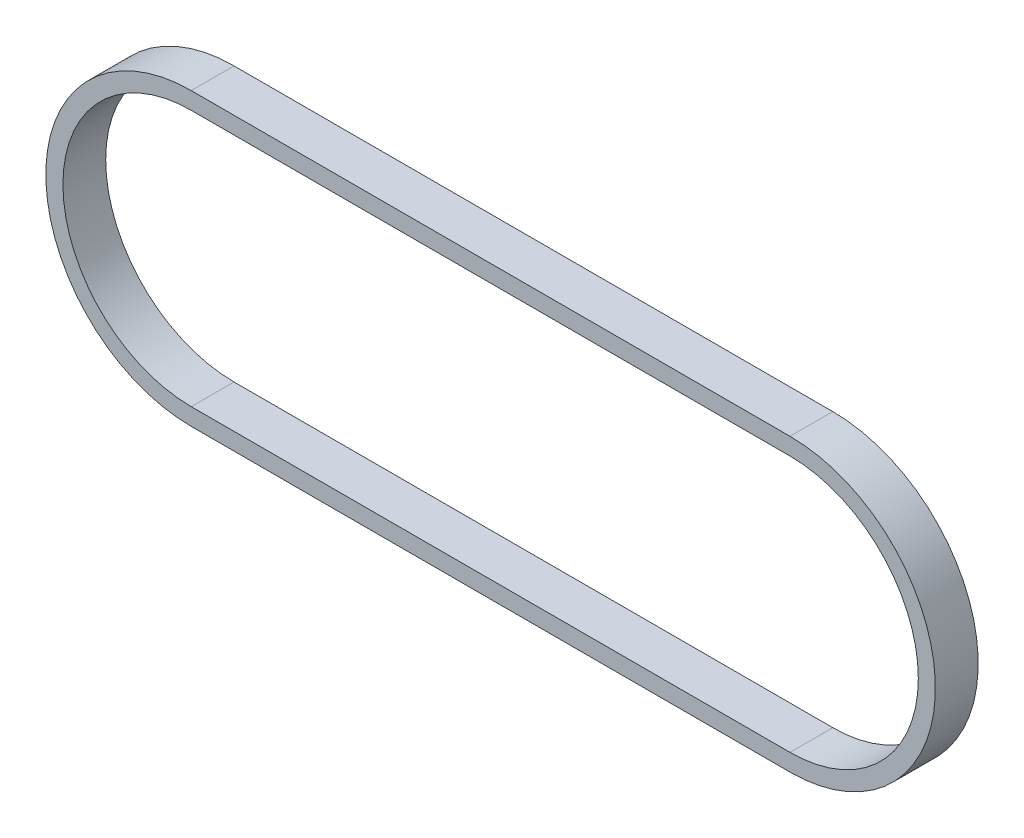
ISO-10303-21;
HEADER;
FILE_DESCRIPTION(('STEP AP214'),'2;1');
FILE_NAME('part.step','',(''),(''),'','','');
FILE_SCHEMA(('AUTOMOTIVE_DESIGN { 1 0 10303 214 1 1 1 1 }'));
ENDSEC;
DATA;
#1=APPLICATION_CONTEXT('core data for automotive mechanical design processes');
#2=APPLICATION_PROTOCOL_DEFINITION('international standard','automotive_design',2000,#1);
#3=PRODUCT_CONTEXT('',#1,'mechanical');
#4=PRODUCT('Part','Part','',(#3));
#5=PRODUCT_RELATED_PRODUCT_CATEGORY('part','',(#4));
#6=PRODUCT_DEFINITION_FORMATION('','',#4);
#7=PRODUCT_DEFINITION_CONTEXT('part definition',#1,'design');
#8=PRODUCT_DEFINITION('design','',#6,#7);
#9=PRODUCT_DEFINITION_SHAPE('','',#8);
#10=(LENGTH_UNIT() NAMED_UNIT(*) SI_UNIT(.MILLI.,.METRE.));
#11=(NAMED_UNIT(*) PLANE_ANGLE_UNIT() SI_UNIT($,.RADIAN.));
#12=(NAMED_UNIT(*) SI_UNIT($,.STERADIAN.) SOLID_ANGLE_UNIT());
#13=UNCERTAINTY_MEASURE_WITH_UNIT(LENGTH_MEASURE(1.E-05),#10,'distance_accuracy_value','');
#14=(GEOMETRIC_REPRESENTATION_CONTEXT(3) GLOBAL_UNCERTAINTY_ASSIGNED_CONTEXT((#13)) GLOBAL_UNIT_ASSIGNED_CONTEXT((#10,
#11,#12)) REPRESENTATION_CONTEXT('',''));
#15=CARTESIAN_POINT('',(0.,0.,0.));
#16=DIRECTION('',(0.,0.,1.));
#17=DIRECTION('',(1.,0.,0.));
#18=AXIS2_PLACEMENT_3D('',#15,#16,#17);
#19=CARTESIAN_POINT('',(0.,8.50000000000001,70.9583174663598));
#20=DIRECTION('',(0.,-1.,0.));
#21=DIRECTION('',(1.,0.,0.));
#22=AXIS2_PLACEMENT_3D('',#19,#20,#21);
#23=PLANE('',#22);
#24=DIRECTION('',(-1.,0.,0.));
#25=VECTOR('',#24,1.);
#26=CARTESIAN_POINT('',(0.,8.50000000000001,16.25));
#27=LINE('',#26,#25);
#28=CARTESIAN_POINT('',(35.,8.50000000000002,16.25));
#29=VERTEX_POINT('',#28);
#30=CARTESIAN_POINT('',(0.,8.50000000000001,16.25));
#31=VERTEX_POINT('',#30);
#32=EDGE_CURVE('E144',#29,#31,#27,.T.);
#33=ORIENTED_EDGE('',*,*,#32,.F.);
#34=DIRECTION('',(0.,0.,-1.));
#35=VECTOR('',#34,1.);
#36=CARTESIAN_POINT('',(35.,8.50000000000002,70.9583174663598));
#37=LINE('',#36,#35);
#38=CARTESIAN_POINT('',(35.,8.50000000000001,13.75));
#39=VERTEX_POINT('',#38);
#40=EDGE_CURVE('E56',#29,#39,#37,.T.);
#41=ORIENTED_EDGE('',*,*,#40,.T.);
#42=DIRECTION('',(1.,0.,0.));
#43=VECTOR('',#42,1.);
#44=CARTESIAN_POINT('',(0.,8.50000000000001,13.75));
#45=LINE('',#44,#43);
#46=CARTESIAN_POINT('',(0.,8.50000000000001,13.75));
#47=VERTEX_POINT('',#46);
#48=EDGE_CURVE('E132',#47,#39,#45,.T.);
#49=ORIENTED_EDGE('',*,*,#48,.F.);
#50=DIRECTION('',(0.,0.,-1.));
#51=VECTOR('',#50,1.);
#52=CARTESIAN_POINT('',(0.,8.50000000000001,70.9583174663598));
#53=LINE('',#52,#51);
#54=EDGE_CURVE('E113',#31,#47,#53,.T.);
#55=ORIENTED_EDGE('',*,*,#54,.F.);
#56=EDGE_LOOP('',(#33,#41,#49,#55));
#57=FACE_BOUND('',#56,.T.);
#58=ADVANCED_FACE('F41',(#57),#23,.F.);
#59=CARTESIAN_POINT('',(35.,0.,70.9583174663598));
#60=DIRECTION('',(0.,0.,-1.));
#61=DIRECTION('',(-1.,0.,0.));
#62=AXIS2_PLACEMENT_3D('',#59,#60,#61);
#63=CYLINDRICAL_SURFACE('',#62,8.50000000000001);
#64=CARTESIAN_POINT('',(35.,0.,16.25));
#65=DIRECTION('',(0.,0.,1.));
#66=DIRECTION('',(1.,0.,0.));
#67=AXIS2_PLACEMENT_3D('',#64,#65,#66);
#68=CIRCLE('',#67,8.50000000000001);
#69=CARTESIAN_POINT('',(35.,-8.50000000000001,16.25));
#70=VERTEX_POINT('',#69);
#71=EDGE_CURVE('E147',#70,#29,#68,.T.);
#72=ORIENTED_EDGE('',*,*,#71,.F.);
#73=DIRECTION('',(0.,0.,-1.));
#74=VECTOR('',#73,1.);
#75=CARTESIAN_POINT('',(35.,-8.50000000000001,70.9583174663598));
#76=LINE('',#75,#74);
#77=CARTESIAN_POINT('',(35.,-8.50000000000001,13.75));
#78=VERTEX_POINT('',#77);
#79=EDGE_CURVE('E163',#70,#78,#76,.T.);
#80=ORIENTED_EDGE('',*,*,#79,.T.);
#81=CARTESIAN_POINT('',(35.,0.,13.75));
#82=DIRECTION('',(0.,0.,1.));
#83=DIRECTION('',(1.,0.,0.));
#84=AXIS2_PLACEMENT_3D('',#81,#82,#83);
#85=CIRCLE('',#84,8.50000000000001);
#86=EDGE_CURVE('E129',#39,#78,#85,.F.);
#87=ORIENTED_EDGE('',*,*,#86,.F.);
#88=ORIENTED_EDGE('',*,*,#40,.F.);
#89=EDGE_LOOP('',(#72,#80,#87,#88));
#90=FACE_BOUND('',#89,.T.);
#91=ADVANCED_FACE('F192',(#90),#63,.T.);
#92=CARTESIAN_POINT('',(0.,-8.50000000000001,70.9583174663598));
#93=DIRECTION('',(0.,1.,0.));
#94=DIRECTION('',(-1.,0.,0.));
#95=AXIS2_PLACEMENT_3D('',#92,#93,#94);
#96=PLANE('',#95);
#97=DIRECTION('',(1.,0.,0.));
#98=VECTOR('',#97,1.);
#99=CARTESIAN_POINT('',(0.,-8.50000000000001,16.25));
#100=LINE('',#99,#98);
#101=CARTESIAN_POINT('',(0.,-8.50000000000001,16.25));
#102=VERTEX_POINT('',#101);
#103=EDGE_CURVE('E150',#102,#70,#100,.T.);
#104=ORIENTED_EDGE('',*,*,#103,.F.);
#105=DIRECTION('',(0.,0.,-1.));
#106=VECTOR('',#105,1.);
#107=CARTESIAN_POINT('',(0.,-8.50000000000001,70.9583174663598));
#108=LINE('',#107,#106);
#109=CARTESIAN_POINT('',(0.,-8.50000000000001,13.75));
#110=VERTEX_POINT('',#109);
#111=EDGE_CURVE('E49',#102,#110,#108,.T.);
#112=ORIENTED_EDGE('',*,*,#111,.T.);
#113=DIRECTION('',(-1.,0.,0.));
#114=VECTOR('',#113,1.);
#115=CARTESIAN_POINT('',(0.,-8.50000000000001,13.75));
#116=LINE('',#115,#114);
#117=EDGE_CURVE('E141',#78,#110,#116,.T.);
#118=ORIENTED_EDGE('',*,*,#117,.F.);
#119=ORIENTED_EDGE('',*,*,#79,.F.);
#120=EDGE_LOOP('',(#104,#112,#118,#119));
#121=FACE_BOUND('',#120,.T.);
#122=ADVANCED_FACE('F168',(#121),#96,.F.);
#123=CARTESIAN_POINT('',(0.,0.,70.9583174663598));
#124=DIRECTION('',(0.,0.,-1.));
#125=DIRECTION('',(-1.,0.,0.));
#126=AXIS2_PLACEMENT_3D('',#123,#124,#125);
#127=CYLINDRICAL_SURFACE('',#126,8.50000000000001);
#128=CARTESIAN_POINT('',(0.,0.,16.25));
#129=DIRECTION('',(0.,0.,1.));
#130=DIRECTION('',(1.,0.,0.));
#131=AXIS2_PLACEMENT_3D('',#128,#129,#130);
#132=CIRCLE('',#131,8.50000000000001);
#133=EDGE_CURVE('E153',#31,#102,#132,.T.);
#134=ORIENTED_EDGE('',*,*,#133,.F.);
#135=ORIENTED_EDGE('',*,*,#54,.T.);
#136=CARTESIAN_POINT('',(0.,0.,13.75));
#137=DIRECTION('',(0.,0.,1.));
#138=DIRECTION('',(1.,0.,0.));
#139=AXIS2_PLACEMENT_3D('',#136,#137,#138);
#140=CIRCLE('',#139,8.50000000000001);
#141=EDGE_CURVE('E125',#110,#47,#140,.F.);
#142=ORIENTED_EDGE('',*,*,#141,.F.);
#143=ORIENTED_EDGE('',*,*,#111,.F.);
#144=EDGE_LOOP('',(#134,#135,#142,#143));
#145=FACE_BOUND('',#144,.T.);
#146=ADVANCED_FACE('F43',(#145),#127,.T.);
#147=CARTESIAN_POINT('',(0.,7.50000000000002,70.9583174663598));
#148=DIRECTION('',(0.,-1.,0.));
#149=DIRECTION('',(1.,0.,0.));
#150=AXIS2_PLACEMENT_3D('',#147,#148,#149);
#151=PLANE('',#150);
#152=DIRECTION('',(0.,0.,-1.));
#153=VECTOR('',#152,1.);
#154=CARTESIAN_POINT('',(35.,7.50000000000001,70.9583174663598));
#155=LINE('',#154,#153);
#156=CARTESIAN_POINT('',(35.,7.50000000000001,16.25));
#157=VERTEX_POINT('',#156);
#158=CARTESIAN_POINT('',(35.,7.50000000000001,13.75));
#159=VERTEX_POINT('',#158);
#160=EDGE_CURVE('E158',#157,#159,#155,.T.);
#161=ORIENTED_EDGE('',*,*,#160,.F.);
#162=DIRECTION('',(-1.,0.,0.));
#163=VECTOR('',#162,1.);
#164=CARTESIAN_POINT('',(0.,7.50000000000002,16.25));
#165=LINE('',#164,#163);
#166=CARTESIAN_POINT('',(0.,7.50000000000002,16.25));
#167=VERTEX_POINT('',#166);
#168=EDGE_CURVE('E11',#157,#167,#165,.T.);
#169=ORIENTED_EDGE('',*,*,#168,.T.);
#170=DIRECTION('',(0.,0.,-1.));
#171=VECTOR('',#170,1.);
#172=CARTESIAN_POINT('',(0.,7.50000000000002,70.9583174663598));
#173=LINE('',#172,#171);
#174=CARTESIAN_POINT('',(0.,7.50000000000002,13.75));
#175=VERTEX_POINT('',#174);
#176=EDGE_CURVE('E156',#167,#175,#173,.T.);
#177=ORIENTED_EDGE('',*,*,#176,.T.);
#178=DIRECTION('',(1.,0.,0.));
#179=VECTOR('',#178,1.);
#180=CARTESIAN_POINT('',(0.,7.50000000000002,13.75));
#181=LINE('',#180,#179);
#182=EDGE_CURVE('E124',#175,#159,#181,.T.);
#183=ORIENTED_EDGE('',*,*,#182,.T.);
#184=EDGE_LOOP('',(#161,#169,#177,#183));
#185=FACE_BOUND('',#184,.T.);
#186=ADVANCED_FACE('F185',(#185),#151,.T.);
#187=CARTESIAN_POINT('',(35.,0.,70.9583174663598));
#188=DIRECTION('',(0.,0.,-1.));
#189=DIRECTION('',(-1.,0.,0.));
#190=AXIS2_PLACEMENT_3D('',#187,#188,#189);
#191=CYLINDRICAL_SURFACE('',#190,7.50000000000001);
#192=DIRECTION('',(0.,0.,-1.));
#193=VECTOR('',#192,1.);
#194=CARTESIAN_POINT('',(35.,-7.50000000000001,70.9583174663598));
#195=LINE('',#194,#193);
#196=CARTESIAN_POINT('',(35.,-7.50000000000001,16.25));
#197=VERTEX_POINT('',#196);
#198=CARTESIAN_POINT('',(35.,-7.50000000000001,13.75));
#199=VERTEX_POINT('',#198);
#200=EDGE_CURVE('E114',#197,#199,#195,.T.);
#201=ORIENTED_EDGE('',*,*,#200,.F.);
#202=CARTESIAN_POINT('',(35.,0.,16.25));
#203=DIRECTION('',(0.,0.,1.));
#204=DIRECTION('',(1.,0.,0.));
#205=AXIS2_PLACEMENT_3D('',#202,#203,#204);
#206=CIRCLE('',#205,7.50000000000001);
#207=EDGE_CURVE('E137',#197,#157,#206,.T.);
#208=ORIENTED_EDGE('',*,*,#207,.T.);
#209=ORIENTED_EDGE('',*,*,#160,.T.);
#210=CARTESIAN_POINT('',(35.,0.,13.75));
#211=DIRECTION('',(0.,0.,1.));
#212=DIRECTION('',(1.,0.,0.));
#213=AXIS2_PLACEMENT_3D('',#210,#211,#212);
#214=CIRCLE('',#213,7.50000000000001);
#215=EDGE_CURVE('E177',#159,#199,#214,.F.);
#216=ORIENTED_EDGE('',*,*,#215,.T.);
#217=EDGE_LOOP('',(#201,#208,#209,#216));
#218=FACE_BOUND('',#217,.T.);
#219=ADVANCED_FACE('F182',(#218),#191,.F.);
#220=CARTESIAN_POINT('',(0.,-7.50000000000002,70.9583174663598));
#221=DIRECTION('',(0.,1.,0.));
#222=DIRECTION('',(-1.,0.,0.));
#223=AXIS2_PLACEMENT_3D('',#220,#221,#222);
#224=PLANE('',#223);
#225=DIRECTION('',(0.,0.,-1.));
#226=VECTOR('',#225,1.);
#227=CARTESIAN_POINT('',(0.,-7.50000000000002,70.9583174663598));
#228=LINE('',#227,#226);
#229=CARTESIAN_POINT('',(0.,-7.50000000000002,16.25));
#230=VERTEX_POINT('',#229);
#231=CARTESIAN_POINT('',(0.,-7.50000000000002,13.75));
#232=VERTEX_POINT('',#231);
#233=EDGE_CURVE('E106',#230,#232,#228,.T.);
#234=ORIENTED_EDGE('',*,*,#233,.F.);
#235=DIRECTION('',(1.,0.,0.));
#236=VECTOR('',#235,1.);
#237=CARTESIAN_POINT('',(0.,-7.50000000000002,16.25));
#238=LINE('',#237,#236);
#239=EDGE_CURVE('E140',#230,#197,#238,.T.);
#240=ORIENTED_EDGE('',*,*,#239,.T.);
#241=ORIENTED_EDGE('',*,*,#200,.T.);
#242=DIRECTION('',(-1.,0.,0.));
#243=VECTOR('',#242,1.);
#244=CARTESIAN_POINT('',(0.,-7.50000000000002,13.75));
#245=LINE('',#244,#243);
#246=EDGE_CURVE('E121',#199,#232,#245,.T.);
#247=ORIENTED_EDGE('',*,*,#246,.T.);
#248=EDGE_LOOP('',(#234,#240,#241,#247));
#249=FACE_BOUND('',#248,.T.);
#250=ADVANCED_FACE('F127',(#249),#224,.T.);
#251=CARTESIAN_POINT('',(0.,0.,70.9583174663598));
#252=DIRECTION('',(0.,0.,-1.));
#253=DIRECTION('',(-1.,0.,0.));
#254=AXIS2_PLACEMENT_3D('',#251,#252,#253);
#255=CYLINDRICAL_SURFACE('',#254,7.50000000000002);
#256=ORIENTED_EDGE('',*,*,#176,.F.);
#257=CARTESIAN_POINT('',(0.,0.,16.25));
#258=DIRECTION('',(0.,0.,1.));
#259=DIRECTION('',(1.,0.,0.));
#260=AXIS2_PLACEMENT_3D('',#257,#258,#259);
#261=CIRCLE('',#260,7.50000000000002);
#262=EDGE_CURVE('E64',#167,#230,#261,.T.);
#263=ORIENTED_EDGE('',*,*,#262,.T.);
#264=ORIENTED_EDGE('',*,*,#233,.T.);
#265=CARTESIAN_POINT('',(0.,0.,13.75));
#266=DIRECTION('',(0.,0.,1.));
#267=DIRECTION('',(1.,0.,0.));
#268=AXIS2_PLACEMENT_3D('',#265,#266,#267);
#269=CIRCLE('',#268,7.50000000000002);
#270=EDGE_CURVE('E109',#232,#175,#269,.F.);
#271=ORIENTED_EDGE('',*,*,#270,.T.);
#272=EDGE_LOOP('',(#256,#263,#264,#271));
#273=FACE_BOUND('',#272,.T.);
#274=ADVANCED_FACE('F108',(#273),#255,.F.);
#275=CARTESIAN_POINT('',(0.,0.,16.25));
#276=DIRECTION('',(0.,0.,1.));
#277=DIRECTION('',(1.,0.,0.));
#278=AXIS2_PLACEMENT_3D('',#275,#276,#277);
#279=PLANE('',#278);
#280=ORIENTED_EDGE('',*,*,#262,.F.);
#281=ORIENTED_EDGE('',*,*,#168,.F.);
#282=ORIENTED_EDGE('',*,*,#207,.F.);
#283=ORIENTED_EDGE('',*,*,#239,.F.);
#284=EDGE_LOOP('',(#280,#281,#282,#283));
#285=FACE_BOUND('',#284,.T.);
#286=ORIENTED_EDGE('',*,*,#32,.T.);
#287=ORIENTED_EDGE('',*,*,#133,.T.);
#288=ORIENTED_EDGE('',*,*,#103,.T.);
#289=ORIENTED_EDGE('',*,*,#71,.T.);
#290=EDGE_LOOP('',(#286,#287,#288,#289));
#291=FACE_BOUND('',#290,.T.);
#292=ADVANCED_FACE('F186',(#285,#291),#279,.T.);
#293=CARTESIAN_POINT('',(0.,0.,13.75));
#294=DIRECTION('',(0.,0.,1.));
#295=DIRECTION('',(1.,0.,0.));
#296=AXIS2_PLACEMENT_3D('',#293,#294,#295);
#297=PLANE('',#296);
#298=ORIENTED_EDGE('',*,*,#141,.T.);
#299=ORIENTED_EDGE('',*,*,#48,.T.);
#300=ORIENTED_EDGE('',*,*,#86,.T.);
#301=ORIENTED_EDGE('',*,*,#117,.T.);
#302=EDGE_LOOP('',(#298,#299,#300,#301));
#303=FACE_BOUND('',#302,.T.);
#304=ORIENTED_EDGE('',*,*,#246,.F.);
#305=ORIENTED_EDGE('',*,*,#215,.F.);
#306=ORIENTED_EDGE('',*,*,#182,.F.);
#307=ORIENTED_EDGE('',*,*,#270,.F.);
#308=EDGE_LOOP('',(#304,#305,#306,#307));
#309=FACE_BOUND('',#308,.T.);
#310=ADVANCED_FACE('F119',(#303,#309),#297,.F.);
#311=CLOSED_SHELL('',(#58,#91,#122,#146,#186,#219,#250,#274,#292,#310));
#312=MANIFOLD_SOLID_BREP('B2',#311);
#313=ADVANCED_BREP_SHAPE_REPRESENTATION('',(#18,#312),#14);
#314=SHAPE_DEFINITION_REPRESENTATION(#9,#313);
ENDSEC;
END-ISO-10303-21;
